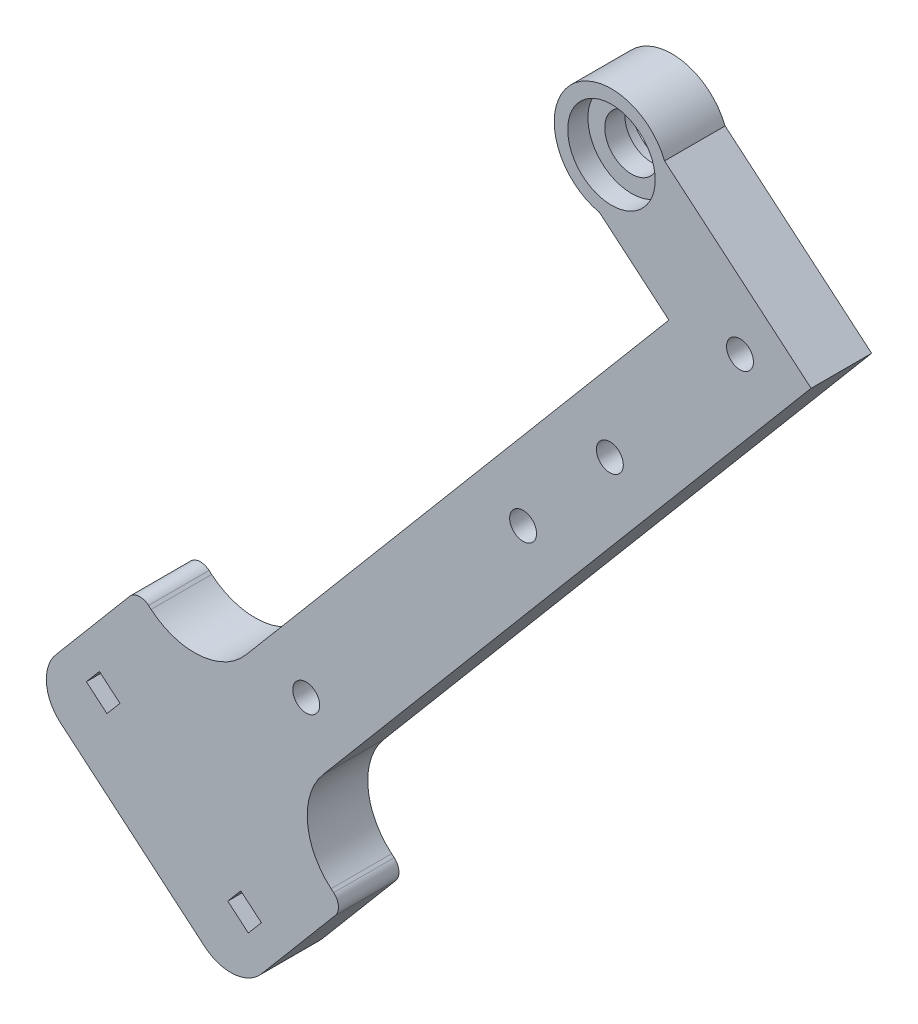
ISO-10303-21;
HEADER;
FILE_DESCRIPTION(('STEP AP214'),'2;1');
FILE_NAME('part.step','',(''),(''),'','','');
FILE_SCHEMA(('AUTOMOTIVE_DESIGN { 1 0 10303 214 1 1 1 1 }'));
ENDSEC;
DATA;
#1=APPLICATION_CONTEXT('core data for automotive mechanical design processes');
#2=APPLICATION_PROTOCOL_DEFINITION('international standard','automotive_design',2000,#1);
#3=PRODUCT_CONTEXT('',#1,'mechanical');
#4=PRODUCT('Part','Part','',(#3));
#5=PRODUCT_RELATED_PRODUCT_CATEGORY('part','',(#4));
#6=PRODUCT_DEFINITION_FORMATION('','',#4);
#7=PRODUCT_DEFINITION_CONTEXT('part definition',#1,'design');
#8=PRODUCT_DEFINITION('design','',#6,#7);
#9=PRODUCT_DEFINITION_SHAPE('','',#8);
#10=(LENGTH_UNIT() NAMED_UNIT(*) SI_UNIT(.MILLI.,.METRE.));
#11=(NAMED_UNIT(*) PLANE_ANGLE_UNIT() SI_UNIT($,.RADIAN.));
#12=(NAMED_UNIT(*) SI_UNIT($,.STERADIAN.) SOLID_ANGLE_UNIT());
#13=UNCERTAINTY_MEASURE_WITH_UNIT(LENGTH_MEASURE(1.E-05),#10,'distance_accuracy_value','');
#14=(GEOMETRIC_REPRESENTATION_CONTEXT(3) GLOBAL_UNCERTAINTY_ASSIGNED_CONTEXT((#13)) GLOBAL_UNIT_ASSIGNED_CONTEXT((#10,
#11,#12)) REPRESENTATION_CONTEXT('',''));
#15=CARTESIAN_POINT('',(0.,0.,0.));
#16=DIRECTION('',(0.,0.,1.));
#17=DIRECTION('',(1.,0.,0.));
#18=AXIS2_PLACEMENT_3D('',#15,#16,#17);
#19=CARTESIAN_POINT('',(-823.227608719742,-58.1969068134453,9.));
#20=DIRECTION('',(0.,0.,-1.));
#21=DIRECTION('',(-1.,0.,0.));
#22=AXIS2_PLACEMENT_3D('',#19,#20,#21);
#23=CYLINDRICAL_SURFACE('',#22,6.4999999999999);
#24=CARTESIAN_POINT('',(-823.227608719742,-58.1969068134453,0.));
#25=DIRECTION('',(0.,0.,1.));
#26=DIRECTION('',(1.,0.,0.));
#27=AXIS2_PLACEMENT_3D('',#24,#25,#26);
#28=CIRCLE('',#27,6.4999999999999);
#29=CARTESIAN_POINT('',(-816.727608719742,-58.1969068134453,0.));
#30=VERTEX_POINT('',#29);
#31=EDGE_CURVE('E307',#30,#30,#28,.T.);
#32=ORIENTED_EDGE('',*,*,#31,.F.);
#33=EDGE_LOOP('',(#32));
#34=FACE_BOUND('',#33,.T.);
#35=CARTESIAN_POINT('',(-823.227608719742,-58.1969068134453,3.));
#36=DIRECTION('',(0.,0.,1.));
#37=DIRECTION('',(1.,0.,0.));
#38=AXIS2_PLACEMENT_3D('',#35,#36,#37);
#39=CIRCLE('',#38,6.4999999999999);
#40=CARTESIAN_POINT('',(-816.727608719742,-58.1969068134453,3.));
#41=VERTEX_POINT('',#40);
#42=EDGE_CURVE('E523',#41,#41,#39,.T.);
#43=ORIENTED_EDGE('',*,*,#42,.T.);
#44=EDGE_LOOP('',(#43));
#45=FACE_BOUND('',#44,.T.);
#46=ADVANCED_FACE('F39',(#34,#45),#23,.F.);
#47=CARTESIAN_POINT('',(-421.116094761306,355.259526568365,9.));
#48=DIRECTION('',(0.76434263161328,-0.644810314354916,0.));
#49=DIRECTION('',(0.644810314354916,0.76434263161328,0.));
#50=AXIS2_PLACEMENT_3D('',#47,#48,#49);
#51=PLANE('',#50);
#52=DIRECTION('',(-0.644810314354916,-0.76434263161328,0.));
#53=VECTOR('',#52,1.);
#54=CARTESIAN_POINT('',(-421.116094761306,355.259526568365,0.));
#55=LINE('',#54,#53);
#56=CARTESIAN_POINT('',(-875.261177033281,-183.073126601523,0.));
#57=VERTEX_POINT('',#56);
#58=CARTESIAN_POINT('',(-877.195607976346,-185.366154496363,0.));
#59=VERTEX_POINT('',#58);
#60=EDGE_CURVE('E301',#57,#59,#55,.T.);
#61=ORIENTED_EDGE('',*,*,#60,.T.);
#62=DIRECTION('',(0.,0.,-1.));
#63=VECTOR('',#62,1.);
#64=CARTESIAN_POINT('',(-877.195607976346,-185.366154496363,9.));
#65=LINE('',#64,#63);
#66=CARTESIAN_POINT('',(-877.195607976346,-185.366154496363,9.));
#67=VERTEX_POINT('',#66);
#68=EDGE_CURVE('E48',#67,#59,#65,.T.);
#69=ORIENTED_EDGE('',*,*,#68,.F.);
#70=DIRECTION('',(-0.644810314354916,-0.76434263161328,0.));
#71=VECTOR('',#70,1.);
#72=CARTESIAN_POINT('',(-421.116094761306,355.259526568365,9.));
#73=LINE('',#72,#71);
#74=CARTESIAN_POINT('',(-875.261177033281,-183.073126601523,9.));
#75=VERTEX_POINT('',#74);
#76=EDGE_CURVE('E216',#75,#67,#73,.T.);
#77=ORIENTED_EDGE('',*,*,#76,.F.);
#78=DIRECTION('',(0.,0.,-1.));
#79=VECTOR('',#78,1.);
#80=CARTESIAN_POINT('',(-875.261177033281,-183.073126601523,9.));
#81=LINE('',#80,#79);
#82=EDGE_CURVE('E311',#75,#57,#81,.T.);
#83=ORIENTED_EDGE('',*,*,#82,.T.);
#84=EDGE_LOOP('',(#61,#69,#77,#83));
#85=FACE_BOUND('',#84,.T.);
#86=ADVANCED_FACE('F518',(#85),#51,.F.);
#87=CARTESIAN_POINT('',(-456.079513215022,-540.625681064728,9.));
#88=DIRECTION('',(-0.644810314354901,-0.764342631613293,0.));
#89=DIRECTION('',(0.764342631613293,-0.644810314354901,0.));
#90=AXIS2_PLACEMENT_3D('',#87,#88,#89);
#91=PLANE('',#90);
#92=DIRECTION('',(-0.764342631613293,0.644810314354901,0.));
#93=VECTOR('',#92,1.);
#94=CARTESIAN_POINT('',(-456.079513215022,-540.625681064728,0.));
#95=LINE('',#94,#93);
#96=CARTESIAN_POINT('',(-880.252978502799,-182.786913238943,0.));
#97=VERTEX_POINT('',#96);
#98=EDGE_CURVE('E223',#59,#97,#95,.T.);
#99=ORIENTED_EDGE('',*,*,#98,.T.);
#100=DIRECTION('',(0.,0.,-1.));
#101=VECTOR('',#100,1.);
#102=CARTESIAN_POINT('',(-880.252978502799,-182.786913238943,9.));
#103=LINE('',#102,#101);
#104=CARTESIAN_POINT('',(-880.252978502799,-182.786913238943,9.));
#105=VERTEX_POINT('',#104);
#106=EDGE_CURVE('E221',#105,#97,#103,.T.);
#107=ORIENTED_EDGE('',*,*,#106,.F.);
#108=DIRECTION('',(-0.764342631613293,0.644810314354901,0.));
#109=VECTOR('',#108,1.);
#110=CARTESIAN_POINT('',(-456.079513215022,-540.625681064728,9.));
#111=LINE('',#110,#109);
#112=EDGE_CURVE('E209',#67,#105,#111,.T.);
#113=ORIENTED_EDGE('',*,*,#112,.F.);
#114=ORIENTED_EDGE('',*,*,#68,.T.);
#115=EDGE_LOOP('',(#99,#107,#113,#114));
#116=FACE_BOUND('',#115,.T.);
#117=ADVANCED_FACE('F222',(#116),#91,.F.);
#118=CARTESIAN_POINT('',(-424.173465287799,357.838767825786,9.));
#119=DIRECTION('',(-0.764342631613309,0.644810314354882,0.));
#120=DIRECTION('',(-0.644810314354882,-0.764342631613309,0.));
#121=AXIS2_PLACEMENT_3D('',#118,#119,#120);
#122=PLANE('',#121);
#123=DIRECTION('',(0.644810314354882,0.764342631613309,0.));
#124=VECTOR('',#123,1.);
#125=CARTESIAN_POINT('',(-424.173465287799,357.838767825786,0.));
#126=LINE('',#125,#124);
#127=CARTESIAN_POINT('',(-878.318547559734,-180.493885344103,0.));
#128=VERTEX_POINT('',#127);
#129=EDGE_CURVE('E133',#97,#128,#126,.T.);
#130=ORIENTED_EDGE('',*,*,#129,.T.);
#131=DIRECTION('',(0.,0.,-1.));
#132=VECTOR('',#131,1.);
#133=CARTESIAN_POINT('',(-878.318547559734,-180.493885344103,9.));
#134=LINE('',#133,#132);
#135=CARTESIAN_POINT('',(-878.318547559734,-180.493885344103,9.));
#136=VERTEX_POINT('',#135);
#137=EDGE_CURVE('E224',#136,#128,#134,.T.);
#138=ORIENTED_EDGE('',*,*,#137,.F.);
#139=DIRECTION('',(0.644810314354882,0.764342631613309,0.));
#140=VECTOR('',#139,1.);
#141=CARTESIAN_POINT('',(-424.173465287799,357.838767825786,9.));
#142=LINE('',#141,#140);
#143=EDGE_CURVE('E214',#105,#136,#142,.T.);
#144=ORIENTED_EDGE('',*,*,#143,.F.);
#145=ORIENTED_EDGE('',*,*,#106,.T.);
#146=EDGE_LOOP('',(#130,#138,#144,#145));
#147=FACE_BOUND('',#146,.T.);
#148=ADVANCED_FACE('F226',(#147),#122,.F.);
#149=CARTESIAN_POINT('',(-442.135517130691,372.991810213125,9.));
#150=DIRECTION('',(0.764342631613295,-0.644810314354899,0.));
#151=DIRECTION('',(0.644810314354899,0.764342631613295,0.));
#152=AXIS2_PLACEMENT_3D('',#149,#150,#151);
#153=PLANE('',#152);
#154=DIRECTION('',(-0.644810314354899,-0.764342631613295,0.));
#155=VECTOR('',#154,1.);
#156=CARTESIAN_POINT('',(-442.135517130691,372.991810213125,0.));
#157=LINE('',#156,#155);
#158=CARTESIAN_POINT('',(-896.280599402647,-165.340842956764,0.));
#159=VERTEX_POINT('',#158);
#160=CARTESIAN_POINT('',(-898.215030345712,-167.633870851604,0.));
#161=VERTEX_POINT('',#160);
#162=EDGE_CURVE('E292',#159,#161,#157,.T.);
#163=ORIENTED_EDGE('',*,*,#162,.T.);
#164=DIRECTION('',(0.,0.,-1.));
#165=VECTOR('',#164,1.);
#166=CARTESIAN_POINT('',(-898.215030345712,-167.633870851604,9.));
#167=LINE('',#166,#165);
#168=CARTESIAN_POINT('',(-898.215030345712,-167.633870851604,9.));
#169=VERTEX_POINT('',#168);
#170=EDGE_CURVE('E313',#169,#161,#167,.T.);
#171=ORIENTED_EDGE('',*,*,#170,.F.);
#172=DIRECTION('',(-0.644810314354899,-0.764342631613295,0.));
#173=VECTOR('',#172,1.);
#174=CARTESIAN_POINT('',(-442.135517130691,372.991810213125,9.));
#175=LINE('',#174,#173);
#176=CARTESIAN_POINT('',(-896.280599402647,-165.340842956764,9.));
#177=VERTEX_POINT('',#176);
#178=EDGE_CURVE('E480',#177,#169,#175,.T.);
#179=ORIENTED_EDGE('',*,*,#178,.F.);
#180=DIRECTION('',(0.,0.,-1.));
#181=VECTOR('',#180,1.);
#182=CARTESIAN_POINT('',(-896.280599402647,-165.340842956764,9.));
#183=LINE('',#182,#181);
#184=EDGE_CURVE('E316',#177,#159,#183,.T.);
#185=ORIENTED_EDGE('',*,*,#184,.T.);
#186=EDGE_LOOP('',(#163,#171,#179,#185));
#187=FACE_BOUND('',#186,.T.);
#188=ADVANCED_FACE('F500',(#187),#153,.F.);
#189=CARTESIAN_POINT('',(-456.079513215044,-540.625681064728,9.));
#190=DIRECTION('',(-0.644810314354919,-0.764342631613278,0.));
#191=DIRECTION('',(0.764342631613278,-0.644810314354919,0.));
#192=AXIS2_PLACEMENT_3D('',#189,#190,#191);
#193=PLANE('',#192);
#194=DIRECTION('',(-0.764342631613278,0.644810314354919,0.));
#195=VECTOR('',#194,1.);
#196=CARTESIAN_POINT('',(-456.079513215044,-540.625681064728,0.));
#197=LINE('',#196,#195);
#198=CARTESIAN_POINT('',(-901.272400872164,-165.054629594184,0.));
#199=VERTEX_POINT('',#198);
#200=EDGE_CURVE('E295',#161,#199,#197,.T.);
#201=ORIENTED_EDGE('',*,*,#200,.T.);
#202=DIRECTION('',(0.,0.,-1.));
#203=VECTOR('',#202,1.);
#204=CARTESIAN_POINT('',(-901.272400872164,-165.054629594184,9.));
#205=LINE('',#204,#203);
#206=CARTESIAN_POINT('',(-901.272400872164,-165.054629594184,9.));
#207=VERTEX_POINT('',#206);
#208=EDGE_CURVE('E322',#207,#199,#205,.T.);
#209=ORIENTED_EDGE('',*,*,#208,.F.);
#210=DIRECTION('',(-0.764342631613278,0.644810314354919,0.));
#211=VECTOR('',#210,1.);
#212=CARTESIAN_POINT('',(-456.079513215044,-540.625681064728,9.));
#213=LINE('',#212,#211);
#214=EDGE_CURVE('E483',#169,#207,#213,.T.);
#215=ORIENTED_EDGE('',*,*,#214,.F.);
#216=ORIENTED_EDGE('',*,*,#170,.T.);
#217=EDGE_LOOP('',(#201,#209,#215,#216));
#218=FACE_BOUND('',#217,.T.);
#219=ADVANCED_FACE('F502',(#218),#193,.F.);
#220=CARTESIAN_POINT('',(-445.192887657148,375.571051470545,9.));
#221=DIRECTION('',(-0.764342631613297,0.644810314354895,0.));
#222=DIRECTION('',(-0.644810314354895,-0.764342631613298,0.));
#223=AXIS2_PLACEMENT_3D('',#220,#221,#222);
#224=PLANE('',#223);
#225=DIRECTION('',(0.644810314354895,0.764342631613297,0.));
#226=VECTOR('',#225,1.);
#227=CARTESIAN_POINT('',(-445.192887657148,375.571051470545,0.));
#228=LINE('',#227,#226);
#229=CARTESIAN_POINT('',(-899.3379699291,-162.761601699344,0.));
#230=VERTEX_POINT('',#229);
#231=EDGE_CURVE('E297',#199,#230,#228,.T.);
#232=ORIENTED_EDGE('',*,*,#231,.T.);
#233=DIRECTION('',(0.,0.,-1.));
#234=VECTOR('',#233,1.);
#235=CARTESIAN_POINT('',(-899.3379699291,-162.761601699344,9.));
#236=LINE('',#235,#234);
#237=CARTESIAN_POINT('',(-899.3379699291,-162.761601699344,9.));
#238=VERTEX_POINT('',#237);
#239=EDGE_CURVE('E319',#238,#230,#236,.T.);
#240=ORIENTED_EDGE('',*,*,#239,.F.);
#241=DIRECTION('',(0.644810314354895,0.764342631613297,0.));
#242=VECTOR('',#241,1.);
#243=CARTESIAN_POINT('',(-445.192887657148,375.571051470545,9.));
#244=LINE('',#243,#242);
#245=EDGE_CURVE('E485',#207,#238,#244,.T.);
#246=ORIENTED_EDGE('',*,*,#245,.F.);
#247=ORIENTED_EDGE('',*,*,#208,.T.);
#248=EDGE_LOOP('',(#232,#240,#246,#247));
#249=FACE_BOUND('',#248,.T.);
#250=ADVANCED_FACE('F506',(#249),#224,.F.);
#251=CARTESIAN_POINT('',(-879.822828210379,-185.766421709469,9.));
#252=DIRECTION('',(0.,0.,-1.));
#253=DIRECTION('',(-1.,0.,0.));
#254=AXIS2_PLACEMENT_3D('',#251,#252,#253);
#255=CYLINDRICAL_SURFACE('',#254,6.0000000000001);
#256=CARTESIAN_POINT('',(-879.822828210379,-185.766421709469,0.));
#257=DIRECTION('',(0.,0.,1.));
#258=DIRECTION('',(1.,0.,0.));
#259=AXIS2_PLACEMENT_3D('',#256,#257,#258);
#260=CIRCLE('',#259,6.0000000000001);
#261=CARTESIAN_POINT('',(-875.236772420699,-189.635283595598,0.));
#262=VERTEX_POINT('',#261);
#263=CARTESIAN_POINT('',(-883.691690096508,-190.352477499148,0.));
#264=VERTEX_POINT('',#263);
#265=EDGE_CURVE('E235',#262,#264,#260,.F.);
#266=ORIENTED_EDGE('',*,*,#265,.F.);
#267=DIRECTION('',(0.,0.,-1.));
#268=VECTOR('',#267,1.);
#269=CARTESIAN_POINT('',(-875.236772420699,-189.635283595598,9.));
#270=LINE('',#269,#268);
#271=CARTESIAN_POINT('',(-875.236772420699,-189.635283595598,9.));
#272=VERTEX_POINT('',#271);
#273=EDGE_CURVE('E147',#272,#262,#270,.T.);
#274=ORIENTED_EDGE('',*,*,#273,.F.);
#275=CARTESIAN_POINT('',(-879.822828210379,-185.766421709469,9.));
#276=DIRECTION('',(0.,0.,1.));
#277=DIRECTION('',(1.,0.,0.));
#278=AXIS2_PLACEMENT_3D('',#275,#276,#277);
#279=CIRCLE('',#278,6.0000000000001);
#280=CARTESIAN_POINT('',(-883.691690096508,-190.352477499148,9.));
#281=VERTEX_POINT('',#280);
#282=EDGE_CURVE('E310',#272,#281,#279,.F.);
#283=ORIENTED_EDGE('',*,*,#282,.T.);
#284=DIRECTION('',(0.,0.,-1.));
#285=VECTOR('',#284,1.);
#286=CARTESIAN_POINT('',(-883.691690096508,-190.352477499148,9.));
#287=LINE('',#286,#285);
#288=EDGE_CURVE('E234',#281,#264,#287,.T.);
#289=ORIENTED_EDGE('',*,*,#288,.T.);
#290=EDGE_LOOP('',(#266,#274,#283,#289));
#291=FACE_BOUND('',#290,.T.);
#292=ADVANCED_FACE('F41',(#291),#255,.T.);
#293=CARTESIAN_POINT('',(-417.867638576977,352.519082732357,9.));
#294=DIRECTION('',(-0.7643426316133,0.644810314354892,0.));
#295=DIRECTION('',(-0.644810314354892,-0.7643426316133,0.));
#296=AXIS2_PLACEMENT_3D('',#293,#294,#295);
#297=PLANE('',#296);
#298=DIRECTION('',(0.644810314354892,0.7643426316133,0.));
#299=VECTOR('',#298,1.);
#300=CARTESIAN_POINT('',(-417.867638576977,352.519082732357,0.));
#301=LINE('',#300,#299);
#302=CARTESIAN_POINT('',(-864.274997076665,-176.641458858172,0.));
#303=VERTEX_POINT('',#302);
#304=EDGE_CURVE('E238',#262,#303,#301,.T.);
#305=ORIENTED_EDGE('',*,*,#304,.T.);
#306=DIRECTION('',(0.,0.,-1.));
#307=VECTOR('',#306,1.);
#308=CARTESIAN_POINT('',(-864.274997076665,-176.641458858172,9.));
#309=LINE('',#308,#307);
#310=CARTESIAN_POINT('',(-864.274997076665,-176.641458858172,9.));
#311=VERTEX_POINT('',#310);
#312=EDGE_CURVE('E358',#311,#303,#309,.T.);
#313=ORIENTED_EDGE('',*,*,#312,.F.);
#314=DIRECTION('',(0.644810314354892,0.7643426316133,0.));
#315=VECTOR('',#314,1.);
#316=CARTESIAN_POINT('',(-417.867638576977,352.519082732357,9.));
#317=LINE('',#316,#315);
#318=EDGE_CURVE('E363',#272,#311,#317,.T.);
#319=ORIENTED_EDGE('',*,*,#318,.F.);
#320=ORIENTED_EDGE('',*,*,#273,.T.);
#321=EDGE_LOOP('',(#305,#313,#319,#320));
#322=FACE_BOUND('',#321,.T.);
#323=ADVANCED_FACE('F361',(#322),#297,.F.);
#324=CARTESIAN_POINT('',(-865.803682339892,-175.351838229462,9.));
#325=DIRECTION('',(0.,0.,-1.));
#326=DIRECTION('',(-1.,0.,0.));
#327=AXIS2_PLACEMENT_3D('',#324,#325,#326);
#328=CYLINDRICAL_SURFACE('',#327,2.00000000000018);
#329=CARTESIAN_POINT('',(-865.803682339892,-175.351838229462,0.));
#330=DIRECTION('',(0.,0.,1.));
#331=DIRECTION('',(1.,0.,0.));
#332=AXIS2_PLACEMENT_3D('',#329,#330,#331);
#333=CIRCLE('',#332,2.00000000000018);
#334=CARTESIAN_POINT('',(-864.514061711182,-173.823152966235,0.));
#335=VERTEX_POINT('',#334);
#336=EDGE_CURVE('E242',#335,#303,#333,.F.);
#337=ORIENTED_EDGE('',*,*,#336,.F.);
#338=DIRECTION('',(0.,0.,-1.));
#339=VECTOR('',#338,1.);
#340=CARTESIAN_POINT('',(-864.514061711182,-173.823152966235,9.));
#341=LINE('',#340,#339);
#342=CARTESIAN_POINT('',(-864.514061711182,-173.823152966235,9.));
#343=VERTEX_POINT('',#342);
#344=EDGE_CURVE('E356',#343,#335,#341,.T.);
#345=ORIENTED_EDGE('',*,*,#344,.F.);
#346=CARTESIAN_POINT('',(-865.803682339892,-175.351838229462,9.));
#347=DIRECTION('',(0.,0.,1.));
#348=DIRECTION('',(1.,0.,0.));
#349=AXIS2_PLACEMENT_3D('',#346,#347,#348);
#350=CIRCLE('',#349,2.00000000000018);
#351=EDGE_CURVE('E442',#343,#311,#350,.F.);
#352=ORIENTED_EDGE('',*,*,#351,.T.);
#353=ORIENTED_EDGE('',*,*,#312,.T.);
#354=EDGE_LOOP('',(#337,#345,#352,#353));
#355=FACE_BOUND('',#354,.T.);
#356=ADVANCED_FACE('F441',(#355),#328,.T.);
#357=CARTESIAN_POINT('',(-445.117737870732,-527.63185632731,9.));
#358=DIRECTION('',(-0.644810314354678,-0.764342631613481,0.));
#359=DIRECTION('',(0.764342631613481,-0.644810314354678,0.));
#360=AXIS2_PLACEMENT_3D('',#357,#358,#359);
#361=PLANE('',#360);
#362=DIRECTION('',(-0.764342631613481,0.644810314354678,0.));
#363=VECTOR('',#362,1.);
#364=CARTESIAN_POINT('',(-445.117737870732,-527.63185632731,0.));
#365=LINE('',#364,#363);
#366=CARTESIAN_POINT('',(-864.896233026989,-173.500747809058,0.));
#367=VERTEX_POINT('',#366);
#368=EDGE_CURVE('E245',#335,#367,#365,.T.);
#369=ORIENTED_EDGE('',*,*,#368,.T.);
#370=DIRECTION('',(0.,0.,-1.));
#371=VECTOR('',#370,1.);
#372=CARTESIAN_POINT('',(-864.896233026989,-173.500747809058,9.));
#373=LINE('',#372,#371);
#374=CARTESIAN_POINT('',(-864.896233026989,-173.500747809058,9.));
#375=VERTEX_POINT('',#374);
#376=EDGE_CURVE('E353',#375,#367,#373,.T.);
#377=ORIENTED_EDGE('',*,*,#376,.F.);
#378=DIRECTION('',(-0.764342631613481,0.644810314354678,0.));
#379=VECTOR('',#378,1.);
#380=CARTESIAN_POINT('',(-445.117737870732,-527.63185632731,9.));
#381=LINE('',#380,#379);
#382=EDGE_CURVE('E437',#343,#375,#381,.T.);
#383=ORIENTED_EDGE('',*,*,#382,.F.);
#384=ORIENTED_EDGE('',*,*,#344,.T.);
#385=EDGE_LOOP('',(#369,#377,#383,#384));
#386=FACE_BOUND('',#385,.T.);
#387=ADVANCED_FACE('F436',(#386),#361,.F.);
#388=CARTESIAN_POINT('',(-858.44812988344,-165.857321492925,9.));
#389=DIRECTION('',(0.,0.,-1.));
#390=DIRECTION('',(-1.,0.,0.));
#391=AXIS2_PLACEMENT_3D('',#388,#389,#390);
#392=CYLINDRICAL_SURFACE('',#391,9.99999999999989);
#393=CARTESIAN_POINT('',(-858.44812988344,-165.857321492925,0.));
#394=DIRECTION('',(0.,0.,1.));
#395=DIRECTION('',(1.,0.,0.));
#396=AXIS2_PLACEMENT_3D('',#393,#394,#395);
#397=CIRCLE('',#396,9.99999999999989);
#398=CARTESIAN_POINT('',(-866.091556199573,-159.409218349376,0.));
#399=VERTEX_POINT('',#398);
#400=EDGE_CURVE('E247',#367,#399,#397,.F.);
#401=ORIENTED_EDGE('',*,*,#400,.T.);
#402=DIRECTION('',(0.,0.,-1.));
#403=VECTOR('',#402,1.);
#404=CARTESIAN_POINT('',(-866.091556199573,-159.409218349376,9.));
#405=LINE('',#404,#403);
#406=CARTESIAN_POINT('',(-866.091556199573,-159.409218349376,9.));
#407=VERTEX_POINT('',#406);
#408=EDGE_CURVE('E350',#407,#399,#405,.T.);
#409=ORIENTED_EDGE('',*,*,#408,.F.);
#410=CARTESIAN_POINT('',(-858.44812988344,-165.857321492925,9.));
#411=DIRECTION('',(0.,0.,1.));
#412=DIRECTION('',(1.,0.,0.));
#413=AXIS2_PLACEMENT_3D('',#410,#411,#412);
#414=CIRCLE('',#413,9.99999999999989);
#415=EDGE_CURVE('E433',#375,#407,#414,.F.);
#416=ORIENTED_EDGE('',*,*,#415,.F.);
#417=ORIENTED_EDGE('',*,*,#376,.T.);
#418=EDGE_LOOP('',(#401,#409,#416,#417));
#419=FACE_BOUND('',#418,.T.);
#420=ADVANCED_FACE('F430',(#419),#392,.F.);
#421=CARTESIAN_POINT('',(-427.421921472166,360.579211661794,9.));
#422=DIRECTION('',(-0.764342631613317,0.644810314354872,0.));
#423=DIRECTION('',(-0.644810314354872,-0.764342631613317,0.));
#424=AXIS2_PLACEMENT_3D('',#421,#422,#423);
#425=PLANE('',#424);
#426=DIRECTION('',(0.644810314354872,0.764342631613317,0.));
#427=VECTOR('',#426,1.);
#428=CARTESIAN_POINT('',(-427.421921472166,360.579211661794,0.));
#429=LINE('',#428,#427);
#430=CARTESIAN_POINT('',(-793.550395834649,-73.4206722928768,0.));
#431=VERTEX_POINT('',#430);
#432=EDGE_CURVE('E249',#399,#431,#429,.T.);
#433=ORIENTED_EDGE('',*,*,#432,.T.);
#434=DIRECTION('',(0.,0.,-1.));
#435=VECTOR('',#434,1.);
#436=CARTESIAN_POINT('',(-793.550395834649,-73.4206722928768,9.));
#437=LINE('',#436,#435);
#438=CARTESIAN_POINT('',(-793.550395834649,-73.4206722928768,9.));
#439=VERTEX_POINT('',#438);
#440=EDGE_CURVE('E348',#439,#431,#437,.T.);
#441=ORIENTED_EDGE('',*,*,#440,.F.);
#442=DIRECTION('',(0.644810314354872,0.764342631613317,0.));
#443=VECTOR('',#442,1.);
#444=CARTESIAN_POINT('',(-427.421921472166,360.579211661794,9.));
#445=LINE('',#444,#443);
#446=EDGE_CURVE('E450',#407,#439,#445,.T.);
#447=ORIENTED_EDGE('',*,*,#446,.F.);
#448=ORIENTED_EDGE('',*,*,#408,.T.);
#449=EDGE_LOOP('',(#433,#441,#447,#448));
#450=FACE_BOUND('',#449,.T.);
#451=ADVANCED_FACE('F426',(#450),#425,.F.);
#452=CARTESIAN_POINT('',(-366.12847436249,-433.999883954671,9.));
#453=DIRECTION('',(0.644810314354878,0.764342631613312,0.));
#454=DIRECTION('',(-0.764342631613312,0.644810314354878,0.));
#455=AXIS2_PLACEMENT_3D('',#452,#453,#454);
#456=PLANE('',#455);
#457=DIRECTION('',(0.764342631613312,-0.644810314354878,0.));
#458=VECTOR('',#457,1.);
#459=CARTESIAN_POINT('',(-366.12847436249,-433.999883954671,0.));
#460=LINE('',#459,#458);
#461=CARTESIAN_POINT('',(-815.334160835627,-55.0435783337646,0.));
#462=VERTEX_POINT('',#461);
#463=EDGE_CURVE('E252',#462,#431,#460,.T.);
#464=ORIENTED_EDGE('',*,*,#463,.F.);
#465=DIRECTION('',(0.,0.,-1.));
#466=VECTOR('',#465,1.);
#467=CARTESIAN_POINT('',(-815.334160835627,-55.0435783337646,9.));
#468=LINE('',#467,#466);
#469=CARTESIAN_POINT('',(-815.334160835627,-55.0435783337646,9.));
#470=VERTEX_POINT('',#469);
#471=EDGE_CURVE('E346',#470,#462,#468,.T.);
#472=ORIENTED_EDGE('',*,*,#471,.F.);
#473=DIRECTION('',(0.764342631613312,-0.644810314354878,0.));
#474=VECTOR('',#473,1.);
#475=CARTESIAN_POINT('',(-366.12847436249,-433.999883954671,9.));
#476=LINE('',#475,#474);
#477=EDGE_CURVE('E423',#470,#439,#476,.T.);
#478=ORIENTED_EDGE('',*,*,#477,.T.);
#479=ORIENTED_EDGE('',*,*,#440,.T.);
#480=EDGE_LOOP('',(#464,#472,#478,#479));
#481=FACE_BOUND('',#480,.T.);
#482=ADVANCED_FACE('F418',(#481),#456,.T.);
#483=CARTESIAN_POINT('',(-823.227608719742,-58.1969068134453,9.));
#484=DIRECTION('',(0.,0.,-1.));
#485=DIRECTION('',(-1.,0.,0.));
#486=AXIS2_PLACEMENT_3D('',#483,#484,#485);
#487=CYLINDRICAL_SURFACE('',#486,8.4999999999999);
#488=CARTESIAN_POINT('',(-823.227608719742,-58.1969068134453,0.));
#489=DIRECTION('',(0.,0.,1.));
#490=DIRECTION('',(1.,0.,0.));
#491=AXIS2_PLACEMENT_3D('',#488,#489,#490);
#492=CIRCLE('',#491,8.4999999999999);
#493=CARTESIAN_POINT('',(-825.006315550952,-66.5087178079649,0.));
#494=VERTEX_POINT('',#493);
#495=EDGE_CURVE('E255',#462,#494,#492,.T.);
#496=ORIENTED_EDGE('',*,*,#495,.T.);
#497=DIRECTION('',(0.,0.,-1.));
#498=VECTOR('',#497,1.);
#499=CARTESIAN_POINT('',(-825.006315550952,-66.5087178079649,9.));
#500=LINE('',#499,#498);
#501=CARTESIAN_POINT('',(-825.006315550952,-66.5087178079649,9.));
#502=VERTEX_POINT('',#501);
#503=EDGE_CURVE('E343',#502,#494,#500,.T.);
#504=ORIENTED_EDGE('',*,*,#503,.F.);
#505=CARTESIAN_POINT('',(-823.227608719742,-58.1969068134453,9.));
#506=DIRECTION('',(0.,0.,1.));
#507=DIRECTION('',(1.,0.,0.));
#508=AXIS2_PLACEMENT_3D('',#505,#506,#507);
#509=CIRCLE('',#508,8.4999999999999);
#510=EDGE_CURVE('E453',#470,#502,#509,.T.);
#511=ORIENTED_EDGE('',*,*,#510,.F.);
#512=ORIENTED_EDGE('',*,*,#471,.T.);
#513=EDGE_LOOP('',(#496,#504,#511,#512));
#514=FACE_BOUND('',#513,.T.);
#515=ADVANCED_FACE('F601',(#514),#487,.T.);
#516=CARTESIAN_POINT('',(-375.800629077816,-445.465023428873,9.));
#517=DIRECTION('',(0.64481031435488,0.764342631613311,0.));
#518=DIRECTION('',(-0.764342631613311,0.64481031435488,0.));
#519=AXIS2_PLACEMENT_3D('',#516,#517,#518);
#520=PLANE('',#519);
#521=DIRECTION('',(0.764342631613311,-0.64481031435488,0.));
#522=VECTOR('',#521,1.);
#523=CARTESIAN_POINT('',(-375.800629077816,-445.465023428873,0.));
#524=LINE('',#523,#522);
#525=CARTESIAN_POINT('',(-814.687690024172,-75.2136570517568,0.));
#526=VERTEX_POINT('',#525);
#527=EDGE_CURVE('E257',#494,#526,#524,.T.);
#528=ORIENTED_EDGE('',*,*,#527,.T.);
#529=DIRECTION('',(0.,0.,-1.));
#530=VECTOR('',#529,1.);
#531=CARTESIAN_POINT('',(-814.687690024172,-75.2136570517568,9.));
#532=LINE('',#531,#530);
#533=CARTESIAN_POINT('',(-814.687690024172,-75.2136570517568,9.));
#534=VERTEX_POINT('',#533);
#535=EDGE_CURVE('E341',#534,#526,#532,.T.);
#536=ORIENTED_EDGE('',*,*,#535,.F.);
#537=DIRECTION('',(0.764342631613311,-0.64481031435488,0.));
#538=VECTOR('',#537,1.);
#539=CARTESIAN_POINT('',(-375.800629077816,-445.465023428873,9.));
#540=LINE('',#539,#538);
#541=EDGE_CURVE('E455',#502,#534,#540,.T.);
#542=ORIENTED_EDGE('',*,*,#541,.F.);
#543=ORIENTED_EDGE('',*,*,#503,.T.);
#544=EDGE_LOOP('',(#528,#536,#542,#543));
#545=FACE_BOUND('',#544,.T.);
#546=ADVANCED_FACE('F411',(#545),#520,.F.);
#547=CARTESIAN_POINT('',(-438.887060946344,370.251366377117,9.));
#548=DIRECTION('',(-0.764342631613301,0.644810314354891,0.));
#549=DIRECTION('',(-0.644810314354891,-0.764342631613301,0.));
#550=AXIS2_PLACEMENT_3D('',#547,#548,#549);
#551=PLANE('',#550);
#552=DIRECTION('',(0.644810314354891,0.764342631613301,0.));
#553=VECTOR('',#552,1.);
#554=CARTESIAN_POINT('',(-438.887060946344,370.251366377117,0.));
#555=LINE('',#554,#553);
#556=CARTESIAN_POINT('',(-877.556695673772,-149.737063634052,0.));
#557=VERTEX_POINT('',#556);
#558=EDGE_CURVE('E260',#557,#526,#555,.T.);
#559=ORIENTED_EDGE('',*,*,#558,.F.);
#560=DIRECTION('',(0.,0.,-1.));
#561=VECTOR('',#560,1.);
#562=CARTESIAN_POINT('',(-877.556695673772,-149.737063634052,9.));
#563=LINE('',#562,#561);
#564=CARTESIAN_POINT('',(-877.556695673772,-149.737063634052,9.));
#565=VERTEX_POINT('',#564);
#566=EDGE_CURVE('E339',#565,#557,#563,.T.);
#567=ORIENTED_EDGE('',*,*,#566,.F.);
#568=DIRECTION('',(0.644810314354891,0.764342631613301,0.));
#569=VECTOR('',#568,1.);
#570=CARTESIAN_POINT('',(-438.887060946344,370.251366377117,9.));
#571=LINE('',#570,#569);
#572=EDGE_CURVE('E408',#565,#534,#571,.T.);
#573=ORIENTED_EDGE('',*,*,#572,.T.);
#574=ORIENTED_EDGE('',*,*,#535,.T.);
#575=EDGE_LOOP('',(#559,#567,#573,#574));
#576=FACE_BOUND('',#575,.T.);
#577=ADVANCED_FACE('F403',(#576),#551,.T.);
#578=CARTESIAN_POINT('',(-885.200121989906,-143.288960490504,9.));
#579=DIRECTION('',(0.,0.,-1.));
#580=DIRECTION('',(-1.,0.,0.));
#581=AXIS2_PLACEMENT_3D('',#578,#579,#580);
#582=CYLINDRICAL_SURFACE('',#581,9.99999999999991);
#583=CARTESIAN_POINT('',(-885.200121989906,-143.288960490504,0.));
#584=DIRECTION('',(0.,0.,1.));
#585=DIRECTION('',(1.,0.,0.));
#586=AXIS2_PLACEMENT_3D('',#583,#584,#585);
#587=CIRCLE('',#586,9.99999999999991);
#588=CARTESIAN_POINT('',(-891.648225133455,-150.932386806637,0.));
#589=VERTEX_POINT('',#588);
#590=EDGE_CURVE('E263',#557,#589,#587,.F.);
#591=ORIENTED_EDGE('',*,*,#590,.T.);
#592=DIRECTION('',(0.,0.,-1.));
#593=VECTOR('',#592,1.);
#594=CARTESIAN_POINT('',(-891.648225133455,-150.932386806637,9.));
#595=LINE('',#594,#593);
#596=CARTESIAN_POINT('',(-891.648225133455,-150.932386806637,9.));
#597=VERTEX_POINT('',#596);
#598=EDGE_CURVE('E336',#597,#589,#595,.T.);
#599=ORIENTED_EDGE('',*,*,#598,.F.);
#600=CARTESIAN_POINT('',(-885.200121989906,-143.288960490504,9.));
#601=DIRECTION('',(0.,0.,1.));
#602=DIRECTION('',(1.,0.,0.));
#603=AXIS2_PLACEMENT_3D('',#600,#601,#602);
#604=CIRCLE('',#603,9.99999999999991);
#605=EDGE_CURVE('E458',#565,#597,#604,.F.);
#606=ORIENTED_EDGE('',*,*,#605,.F.);
#607=ORIENTED_EDGE('',*,*,#566,.T.);
#608=EDGE_LOOP('',(#591,#599,#606,#607));
#609=FACE_BOUND('',#608,.T.);
#610=ADVANCED_FACE('F594',(#609),#582,.F.);
#611=CARTESIAN_POINT('',(-445.117737871253,-527.631856327303,9.));
#612=DIRECTION('',(-0.644810314355124,-0.764342631613105,0.));
#613=DIRECTION('',(0.764342631613105,-0.644810314355124,0.));
#614=AXIS2_PLACEMENT_3D('',#611,#612,#613);
#615=PLANE('',#614);
#616=DIRECTION('',(-0.764342631613105,0.644810314355124,0.));
#617=VECTOR('',#616,1.);
#618=CARTESIAN_POINT('',(-445.117737871253,-527.631856327303,0.));
#619=LINE('',#618,#617);
#620=CARTESIAN_POINT('',(-892.030396449261,-150.609981649459,0.));
#621=VERTEX_POINT('',#620);
#622=EDGE_CURVE('E265',#589,#621,#619,.T.);
#623=ORIENTED_EDGE('',*,*,#622,.T.);
#624=DIRECTION('',(0.,0.,-1.));
#625=VECTOR('',#624,1.);
#626=CARTESIAN_POINT('',(-892.030396449261,-150.609981649459,9.));
#627=LINE('',#626,#625);
#628=CARTESIAN_POINT('',(-892.030396449261,-150.609981649459,9.));
#629=VERTEX_POINT('',#628);
#630=EDGE_CURVE('E334',#629,#621,#627,.T.);
#631=ORIENTED_EDGE('',*,*,#630,.F.);
#632=DIRECTION('',(-0.764342631613105,0.644810314355124,0.));
#633=VECTOR('',#632,1.);
#634=CARTESIAN_POINT('',(-445.117737871253,-527.631856327303,9.));
#635=LINE('',#634,#633);
#636=EDGE_CURVE('E460',#597,#629,#635,.T.);
#637=ORIENTED_EDGE('',*,*,#636,.F.);
#638=ORIENTED_EDGE('',*,*,#598,.T.);
#639=EDGE_LOOP('',(#623,#631,#637,#638));
#640=FACE_BOUND('',#639,.T.);
#641=ADVANCED_FACE('F396',(#640),#615,.F.);
#642=CARTESIAN_POINT('',(-893.320017077971,-152.138666912686,9.));
#643=DIRECTION('',(0.,0.,-1.));
#644=DIRECTION('',(-1.,0.,0.));
#645=AXIS2_PLACEMENT_3D('',#642,#643,#644);
#646=CYLINDRICAL_SURFACE('',#645,1.99999999999995);
#647=CARTESIAN_POINT('',(-893.320017077971,-152.138666912686,0.));
#648=DIRECTION('',(0.,0.,1.));
#649=DIRECTION('',(1.,0.,0.));
#650=AXIS2_PLACEMENT_3D('',#647,#648,#649);
#651=CIRCLE('',#650,1.99999999999995);
#652=CARTESIAN_POINT('',(-894.848702341198,-150.849046283976,0.));
#653=VERTEX_POINT('',#652);
#654=EDGE_CURVE('E268',#653,#621,#651,.F.);
#655=ORIENTED_EDGE('',*,*,#654,.F.);
#656=DIRECTION('',(0.,0.,-1.));
#657=VECTOR('',#656,1.);
#658=CARTESIAN_POINT('',(-894.848702341198,-150.849046283976,9.));
#659=LINE('',#658,#657);
#660=CARTESIAN_POINT('',(-894.848702341198,-150.849046283976,9.));
#661=VERTEX_POINT('',#660);
#662=EDGE_CURVE('E332',#661,#653,#659,.T.);
#663=ORIENTED_EDGE('',*,*,#662,.F.);
#664=CARTESIAN_POINT('',(-893.320017077971,-152.138666912686,9.));
#665=DIRECTION('',(0.,0.,1.));
#666=DIRECTION('',(1.,0.,0.));
#667=AXIS2_PLACEMENT_3D('',#664,#665,#666);
#668=CIRCLE('',#667,1.99999999999995);
#669=EDGE_CURVE('E393',#661,#629,#668,.F.);
#670=ORIENTED_EDGE('',*,*,#669,.T.);
#671=ORIENTED_EDGE('',*,*,#630,.T.);
#672=EDGE_LOOP('',(#655,#663,#670,#671));
#673=FACE_BOUND('',#672,.T.);
#674=ADVANCED_FACE('F389',(#673),#646,.T.);
#675=CARTESIAN_POINT('',(-448.441343841504,378.311495306553,9.));
#676=DIRECTION('',(0.764342631613297,-0.644810314354896,0.));
#677=DIRECTION('',(0.644810314354896,0.764342631613297,0.));
#678=AXIS2_PLACEMENT_3D('',#675,#676,#677);
#679=PLANE('',#678);
#680=DIRECTION('',(-0.644810314354896,-0.764342631613297,0.));
#681=VECTOR('',#680,1.);
#682=CARTESIAN_POINT('',(-448.441343841504,378.311495306553,0.));
#683=LINE('',#682,#681);
#684=CARTESIAN_POINT('',(-905.810477685231,-163.842871021402,0.));
#685=VERTEX_POINT('',#684);
#686=EDGE_CURVE('E271',#653,#685,#683,.T.);
#687=ORIENTED_EDGE('',*,*,#686,.T.);
#688=DIRECTION('',(0.,0.,-1.));
#689=VECTOR('',#688,1.);
#690=CARTESIAN_POINT('',(-905.810477685231,-163.842871021402,9.));
#691=LINE('',#690,#689);
#692=CARTESIAN_POINT('',(-905.810477685231,-163.842871021402,9.));
#693=VERTEX_POINT('',#692);
#694=EDGE_CURVE('E330',#693,#685,#691,.T.);
#695=ORIENTED_EDGE('',*,*,#694,.F.);
#696=DIRECTION('',(-0.644810314354896,-0.764342631613297,0.));
#697=VECTOR('',#696,1.);
#698=CARTESIAN_POINT('',(-448.441343841504,378.311495306553,9.));
#699=LINE('',#698,#697);
#700=EDGE_CURVE('E463',#661,#693,#699,.T.);
#701=ORIENTED_EDGE('',*,*,#700,.F.);
#702=ORIENTED_EDGE('',*,*,#662,.T.);
#703=EDGE_LOOP('',(#687,#695,#701,#702));
#704=FACE_BOUND('',#703,.T.);
#705=ADVANCED_FACE('F385',(#704),#679,.F.);
#706=CARTESIAN_POINT('',(-901.224421895551,-167.711732907532,9.));
#707=DIRECTION('',(0.,0.,-1.));
#708=DIRECTION('',(-1.,0.,0.));
#709=AXIS2_PLACEMENT_3D('',#706,#707,#708);
#710=CYLINDRICAL_SURFACE('',#709,5.99999999999996);
#711=CARTESIAN_POINT('',(-901.224421895551,-167.711732907532,0.));
#712=DIRECTION('',(0.,0.,1.));
#713=DIRECTION('',(1.,0.,0.));
#714=AXIS2_PLACEMENT_3D('',#711,#712,#713);
#715=CIRCLE('',#714,5.99999999999996);
#716=CARTESIAN_POINT('',(-905.09328378168,-172.297788697212,0.));
#717=VERTEX_POINT('',#716);
#718=EDGE_CURVE('E274',#717,#685,#715,.F.);
#719=ORIENTED_EDGE('',*,*,#718,.F.);
#720=DIRECTION('',(0.,0.,-1.));
#721=VECTOR('',#720,1.);
#722=CARTESIAN_POINT('',(-905.09328378168,-172.297788697212,9.));
#723=LINE('',#722,#721);
#724=CARTESIAN_POINT('',(-905.09328378168,-172.297788697212,9.));
#725=VERTEX_POINT('',#724);
#726=EDGE_CURVE('E328',#725,#717,#723,.T.);
#727=ORIENTED_EDGE('',*,*,#726,.F.);
#728=CARTESIAN_POINT('',(-901.224421895551,-167.711732907532,9.));
#729=DIRECTION('',(0.,0.,1.));
#730=DIRECTION('',(1.,0.,0.));
#731=AXIS2_PLACEMENT_3D('',#728,#729,#730);
#732=CIRCLE('',#731,5.99999999999996);
#733=EDGE_CURVE('E382',#725,#693,#732,.F.);
#734=ORIENTED_EDGE('',*,*,#733,.T.);
#735=ORIENTED_EDGE('',*,*,#694,.T.);
#736=EDGE_LOOP('',(#719,#727,#734,#735));
#737=FACE_BOUND('',#736,.T.);
#738=ADVANCED_FACE('F378',(#737),#710,.T.);
#739=CARTESIAN_POINT('',(-454.145082271916,-538.33265316989,9.));
#740=DIRECTION('',(0.644810314354865,0.764342631613323,0.));
#741=DIRECTION('',(-0.764342631613323,0.644810314354865,0.));
#742=AXIS2_PLACEMENT_3D('',#739,#740,#741);
#743=PLANE('',#742);
#744=DIRECTION('',(0.764342631613323,-0.644810314354865,0.));
#745=VECTOR('',#744,1.);
#746=CARTESIAN_POINT('',(-454.145082271916,-538.33265316989,0.));
#747=LINE('',#746,#745);
#748=EDGE_CURVE('E139',#128,#57,#747,.T.);
#749=ORIENTED_EDGE('',*,*,#748,.T.);
#750=ORIENTED_EDGE('',*,*,#82,.F.);
#751=DIRECTION('',(0.764342631613323,-0.644810314354865,0.));
#752=VECTOR('',#751,1.);
#753=CARTESIAN_POINT('',(-454.145082271916,-538.33265316989,9.));
#754=LINE('',#753,#752);
#755=EDGE_CURVE('E56',#136,#75,#754,.T.);
#756=ORIENTED_EDGE('',*,*,#755,.F.);
#757=ORIENTED_EDGE('',*,*,#137,.T.);
#758=EDGE_LOOP('',(#749,#750,#756,#757));
#759=FACE_BOUND('',#758,.T.);
#760=ADVANCED_FACE('F550',(#759),#743,.F.);
#761=CARTESIAN_POINT('',(-454.145082271944,-538.332653169889,9.));
#762=DIRECTION('',(0.644810314354889,0.764342631613303,0.));
#763=DIRECTION('',(-0.764342631613303,0.644810314354889,0.));
#764=AXIS2_PLACEMENT_3D('',#761,#762,#763);
#765=PLANE('',#764);
#766=DIRECTION('',(0.764342631613303,-0.644810314354889,0.));
#767=VECTOR('',#766,1.);
#768=CARTESIAN_POINT('',(-454.145082271944,-538.332653169889,0.));
#769=LINE('',#768,#767);
#770=EDGE_CURVE('E299',#230,#159,#769,.T.);
#771=ORIENTED_EDGE('',*,*,#770,.T.);
#772=ORIENTED_EDGE('',*,*,#184,.F.);
#773=DIRECTION('',(0.764342631613303,-0.644810314354889,0.));
#774=VECTOR('',#773,1.);
#775=CARTESIAN_POINT('',(-454.145082271944,-538.332653169889,9.));
#776=LINE('',#775,#774);
#777=EDGE_CURVE('E487',#238,#177,#776,.T.);
#778=ORIENTED_EDGE('',*,*,#777,.F.);
#779=ORIENTED_EDGE('',*,*,#239,.T.);
#780=EDGE_LOOP('',(#771,#772,#778,#779));
#781=FACE_BOUND('',#780,.T.);
#782=ADVANCED_FACE('F496',(#781),#765,.F.);
#783=CARTESIAN_POINT('',(-804.11904292941,-74.3171646723175,9.));
#784=DIRECTION('',(0.,0.,-1.));
#785=DIRECTION('',(-1.,0.,0.));
#786=AXIS2_PLACEMENT_3D('',#783,#784,#785);
#787=CYLINDRICAL_SURFACE('',#786,2.);
#788=CARTESIAN_POINT('',(-804.11904292941,-74.3171646723175,9.));
#789=DIRECTION('',(0.,0.,1.));
#790=DIRECTION('',(1.,0.,0.));
#791=AXIS2_PLACEMENT_3D('',#788,#789,#790);
#792=CIRCLE('',#791,2.);
#793=CARTESIAN_POINT('',(-802.11904292941,-74.3171646723175,9.));
#794=VERTEX_POINT('',#793);
#795=EDGE_CURVE('E477',#794,#794,#792,.T.);
#796=ORIENTED_EDGE('',*,*,#795,.T.);
#797=EDGE_LOOP('',(#796));
#798=FACE_BOUND('',#797,.T.);
#799=CARTESIAN_POINT('',(-804.11904292941,-74.3171646723175,0.));
#800=DIRECTION('',(0.,0.,1.));
#801=DIRECTION('',(1.,0.,0.));
#802=AXIS2_PLACEMENT_3D('',#799,#800,#801);
#803=CIRCLE('',#802,2.);
#804=CARTESIAN_POINT('',(-802.11904292941,-74.3171646723175,0.));
#805=VERTEX_POINT('',#804);
#806=EDGE_CURVE('E289',#805,#805,#803,.T.);
#807=ORIENTED_EDGE('',*,*,#806,.F.);
#808=EDGE_LOOP('',(#807));
#809=FACE_BOUND('',#808,.T.);
#810=ADVANCED_FACE('F562',(#798,#809),#787,.F.);
#811=CARTESIAN_POINT('',(-868.600074364899,-150.751427833648,9.));
#812=DIRECTION('',(0.,0.,-1.));
#813=DIRECTION('',(-1.,0.,0.));
#814=AXIS2_PLACEMENT_3D('',#811,#812,#813);
#815=CYLINDRICAL_SURFACE('',#814,2.);
#816=CARTESIAN_POINT('',(-868.600074364899,-150.751427833648,9.));
#817=DIRECTION('',(0.,0.,1.));
#818=DIRECTION('',(1.,0.,0.));
#819=AXIS2_PLACEMENT_3D('',#816,#817,#818);
#820=CIRCLE('',#819,2.);
#821=CARTESIAN_POINT('',(-866.600074364899,-150.751427833648,9.));
#822=VERTEX_POINT('',#821);
#823=EDGE_CURVE('E474',#822,#822,#820,.T.);
#824=ORIENTED_EDGE('',*,*,#823,.T.);
#825=EDGE_LOOP('',(#824));
#826=FACE_BOUND('',#825,.T.);
#827=CARTESIAN_POINT('',(-868.600074364899,-150.751427833648,0.));
#828=DIRECTION('',(0.,0.,1.));
#829=DIRECTION('',(1.,0.,0.));
#830=AXIS2_PLACEMENT_3D('',#827,#828,#829);
#831=CIRCLE('',#830,2.);
#832=CARTESIAN_POINT('',(-866.600074364899,-150.751427833648,0.));
#833=VERTEX_POINT('',#832);
#834=EDGE_CURVE('E286',#833,#833,#831,.T.);
#835=ORIENTED_EDGE('',*,*,#834,.F.);
#836=EDGE_LOOP('',(#835));
#837=FACE_BOUND('',#836,.T.);
#838=ADVANCED_FACE('F571',(#826,#837),#815,.F.);
#839=CARTESIAN_POINT('',(-836.359558647154,-112.534296252983,9.));
#840=DIRECTION('',(0.,0.,-1.));
#841=DIRECTION('',(-1.,0.,0.));
#842=AXIS2_PLACEMENT_3D('',#839,#840,#841);
#843=CYLINDRICAL_SURFACE('',#842,1.99999999999993);
#844=CARTESIAN_POINT('',(-836.359558647154,-112.534296252983,9.));
#845=DIRECTION('',(0.,0.,1.));
#846=DIRECTION('',(1.,0.,0.));
#847=AXIS2_PLACEMENT_3D('',#844,#845,#846);
#848=CIRCLE('',#847,1.99999999999993);
#849=CARTESIAN_POINT('',(-834.359558647154,-112.534296252983,9.));
#850=VERTEX_POINT('',#849);
#851=EDGE_CURVE('E471',#850,#850,#848,.T.);
#852=ORIENTED_EDGE('',*,*,#851,.T.);
#853=EDGE_LOOP('',(#852));
#854=FACE_BOUND('',#853,.T.);
#855=CARTESIAN_POINT('',(-836.359558647154,-112.534296252983,0.));
#856=DIRECTION('',(0.,0.,1.));
#857=DIRECTION('',(1.,0.,0.));
#858=AXIS2_PLACEMENT_3D('',#855,#856,#857);
#859=CIRCLE('',#858,1.99999999999993);
#860=CARTESIAN_POINT('',(-834.359558647154,-112.534296252983,0.));
#861=VERTEX_POINT('',#860);
#862=EDGE_CURVE('E283',#861,#861,#859,.T.);
#863=ORIENTED_EDGE('',*,*,#862,.F.);
#864=EDGE_LOOP('',(#863));
#865=FACE_BOUND('',#864,.T.);
#866=ADVANCED_FACE('F575',(#854,#865),#843,.F.);
#867=CARTESIAN_POINT('',(-823.463352360056,-97.2474436207166,9.));
#868=DIRECTION('',(0.,0.,-1.));
#869=DIRECTION('',(-1.,0.,0.));
#870=AXIS2_PLACEMENT_3D('',#867,#868,#869);
#871=CYLINDRICAL_SURFACE('',#870,2.00000000000012);
#872=CARTESIAN_POINT('',(-823.463352360056,-97.2474436207166,9.));
#873=DIRECTION('',(0.,0.,1.));
#874=DIRECTION('',(1.,0.,0.));
#875=AXIS2_PLACEMENT_3D('',#872,#873,#874);
#876=CIRCLE('',#875,2.00000000000012);
#877=CARTESIAN_POINT('',(-821.463352360056,-97.2474436207166,9.));
#878=VERTEX_POINT('',#877);
#879=EDGE_CURVE('E468',#878,#878,#876,.T.);
#880=ORIENTED_EDGE('',*,*,#879,.T.);
#881=EDGE_LOOP('',(#880));
#882=FACE_BOUND('',#881,.T.);
#883=CARTESIAN_POINT('',(-823.463352360056,-97.2474436207166,0.));
#884=DIRECTION('',(0.,0.,1.));
#885=DIRECTION('',(1.,0.,0.));
#886=AXIS2_PLACEMENT_3D('',#883,#884,#885);
#887=CIRCLE('',#886,2.00000000000012);
#888=CARTESIAN_POINT('',(-821.463352360056,-97.2474436207166,0.));
#889=VERTEX_POINT('',#888);
#890=EDGE_CURVE('E280',#889,#889,#887,.T.);
#891=ORIENTED_EDGE('',*,*,#890,.F.);
#892=EDGE_LOOP('',(#891));
#893=FACE_BOUND('',#892,.T.);
#894=ADVANCED_FACE('F579',(#882,#893),#871,.F.);
#895=CARTESIAN_POINT('',(-461.237995729848,-546.740422117635,9.));
#896=DIRECTION('',(0.644810314354889,0.764342631613303,0.));
#897=DIRECTION('',(-0.764342631613303,0.644810314354889,0.));
#898=AXIS2_PLACEMENT_3D('',#895,#896,#897);
#899=PLANE('',#898);
#900=DIRECTION('',(0.764342631613303,-0.644810314354889,0.));
#901=VECTOR('',#900,1.);
#902=CARTESIAN_POINT('',(-461.237995729848,-546.740422117635,0.));
#903=LINE('',#902,#901);
#904=EDGE_CURVE('E277',#717,#264,#903,.T.);
#905=ORIENTED_EDGE('',*,*,#904,.T.);
#906=ORIENTED_EDGE('',*,*,#288,.F.);
#907=DIRECTION('',(0.764342631613303,-0.644810314354889,0.));
#908=VECTOR('',#907,1.);
#909=CARTESIAN_POINT('',(-461.237995729848,-546.740422117635,9.));
#910=LINE('',#909,#908);
#911=EDGE_CURVE('E466',#725,#281,#910,.T.);
#912=ORIENTED_EDGE('',*,*,#911,.F.);
#913=ORIENTED_EDGE('',*,*,#726,.T.);
#914=EDGE_LOOP('',(#905,#906,#912,#913));
#915=FACE_BOUND('',#914,.T.);
#916=ADVANCED_FACE('F374',(#915),#899,.F.);
#917=CARTESIAN_POINT('',(-823.227608719742,-58.1969068134453,6.));
#918=DIRECTION('',(0.,0.,1.));
#919=DIRECTION('',(1.,0.,0.));
#920=AXIS2_PLACEMENT_3D('',#917,#918,#919);
#921=CIRCLE('',#920,6.4999999999999);
#922=CARTESIAN_POINT('',(-816.727608719742,-58.1969068134453,6.));
#923=VERTEX_POINT('',#922);
#924=EDGE_CURVE('E11',#923,#923,#921,.T.);
#925=ORIENTED_EDGE('',*,*,#924,.F.);
#926=EDGE_LOOP('',(#925));
#927=FACE_BOUND('',#926,.T.);
#928=CARTESIAN_POINT('',(-823.227608719742,-58.1969068134453,9.));
#929=DIRECTION('',(0.,0.,1.));
#930=DIRECTION('',(1.,0.,0.));
#931=AXIS2_PLACEMENT_3D('',#928,#929,#930);
#932=CIRCLE('',#931,6.4999999999999);
#933=CARTESIAN_POINT('',(-816.727608719742,-58.1969068134453,9.));
#934=VERTEX_POINT('',#933);
#935=EDGE_CURVE('E228',#934,#934,#932,.T.);
#936=ORIENTED_EDGE('',*,*,#935,.T.);
#937=EDGE_LOOP('',(#936));
#938=FACE_BOUND('',#937,.T.);
#939=ADVANCED_FACE('F520',(#927,#938),#23,.F.);
#940=CARTESIAN_POINT('',(0.,0.,9.));
#941=DIRECTION('',(0.,0.,1.));
#942=DIRECTION('',(1.,0.,0.));
#943=AXIS2_PLACEMENT_3D('',#940,#941,#942);
#944=PLANE('',#943);
#945=ORIENTED_EDGE('',*,*,#282,.F.);
#946=ORIENTED_EDGE('',*,*,#318,.T.);
#947=ORIENTED_EDGE('',*,*,#351,.F.);
#948=ORIENTED_EDGE('',*,*,#382,.T.);
#949=ORIENTED_EDGE('',*,*,#415,.T.);
#950=ORIENTED_EDGE('',*,*,#446,.T.);
#951=ORIENTED_EDGE('',*,*,#477,.F.);
#952=ORIENTED_EDGE('',*,*,#510,.T.);
#953=ORIENTED_EDGE('',*,*,#541,.T.);
#954=ORIENTED_EDGE('',*,*,#572,.F.);
#955=ORIENTED_EDGE('',*,*,#605,.T.);
#956=ORIENTED_EDGE('',*,*,#636,.T.);
#957=ORIENTED_EDGE('',*,*,#669,.F.);
#958=ORIENTED_EDGE('',*,*,#700,.T.);
#959=ORIENTED_EDGE('',*,*,#733,.F.);
#960=ORIENTED_EDGE('',*,*,#911,.T.);
#961=EDGE_LOOP('',(#945,#946,#947,#948,#949,#950,#951,#952,#953,#954,#955,#956,#957,#958,#959,#960));
#962=FACE_BOUND('',#961,.T.);
#963=ORIENTED_EDGE('',*,*,#879,.F.);
#964=EDGE_LOOP('',(#963));
#965=FACE_BOUND('',#964,.T.);
#966=ORIENTED_EDGE('',*,*,#851,.F.);
#967=EDGE_LOOP('',(#966));
#968=FACE_BOUND('',#967,.T.);
#969=ORIENTED_EDGE('',*,*,#823,.F.);
#970=EDGE_LOOP('',(#969));
#971=FACE_BOUND('',#970,.T.);
#972=ORIENTED_EDGE('',*,*,#795,.F.);
#973=EDGE_LOOP('',(#972));
#974=FACE_BOUND('',#973,.T.);
#975=ORIENTED_EDGE('',*,*,#178,.T.);
#976=ORIENTED_EDGE('',*,*,#214,.T.);
#977=ORIENTED_EDGE('',*,*,#245,.T.);
#978=ORIENTED_EDGE('',*,*,#777,.T.);
#979=EDGE_LOOP('',(#975,#976,#977,#978));
#980=FACE_BOUND('',#979,.T.);
#981=ORIENTED_EDGE('',*,*,#76,.T.);
#982=ORIENTED_EDGE('',*,*,#112,.T.);
#983=ORIENTED_EDGE('',*,*,#143,.T.);
#984=ORIENTED_EDGE('',*,*,#755,.T.);
#985=EDGE_LOOP('',(#981,#982,#983,#984));
#986=FACE_BOUND('',#985,.T.);
#987=ORIENTED_EDGE('',*,*,#935,.F.);
#988=EDGE_LOOP('',(#987));
#989=FACE_BOUND('',#988,.T.);
#990=ADVANCED_FACE('F211',(#962,#965,#968,#971,#974,#980,#986,#989),#944,.T.);
#991=CARTESIAN_POINT('',(0.,0.,0.));
#992=DIRECTION('',(0.,0.,1.));
#993=DIRECTION('',(1.,0.,0.));
#994=AXIS2_PLACEMENT_3D('',#991,#992,#993);
#995=PLANE('',#994);
#996=ORIENTED_EDGE('',*,*,#265,.T.);
#997=ORIENTED_EDGE('',*,*,#904,.F.);
#998=ORIENTED_EDGE('',*,*,#718,.T.);
#999=ORIENTED_EDGE('',*,*,#686,.F.);
#1000=ORIENTED_EDGE('',*,*,#654,.T.);
#1001=ORIENTED_EDGE('',*,*,#622,.F.);
#1002=ORIENTED_EDGE('',*,*,#590,.F.);
#1003=ORIENTED_EDGE('',*,*,#558,.T.);
#1004=ORIENTED_EDGE('',*,*,#527,.F.);
#1005=ORIENTED_EDGE('',*,*,#495,.F.);
#1006=ORIENTED_EDGE('',*,*,#463,.T.);
#1007=ORIENTED_EDGE('',*,*,#432,.F.);
#1008=ORIENTED_EDGE('',*,*,#400,.F.);
#1009=ORIENTED_EDGE('',*,*,#368,.F.);
#1010=ORIENTED_EDGE('',*,*,#336,.T.);
#1011=ORIENTED_EDGE('',*,*,#304,.F.);
#1012=EDGE_LOOP('',(#996,#997,#998,#999,#1000,#1001,#1002,#1003,#1004,#1005,#1006,#1007,#1008,
#1009,#1010,#1011));
#1013=FACE_BOUND('',#1012,.T.);
#1014=ORIENTED_EDGE('',*,*,#890,.T.);
#1015=EDGE_LOOP('',(#1014));
#1016=FACE_BOUND('',#1015,.T.);
#1017=ORIENTED_EDGE('',*,*,#862,.T.);
#1018=EDGE_LOOP('',(#1017));
#1019=FACE_BOUND('',#1018,.T.);
#1020=ORIENTED_EDGE('',*,*,#834,.T.);
#1021=EDGE_LOOP('',(#1020));
#1022=FACE_BOUND('',#1021,.T.);
#1023=ORIENTED_EDGE('',*,*,#806,.T.);
#1024=EDGE_LOOP('',(#1023));
#1025=FACE_BOUND('',#1024,.T.);
#1026=ORIENTED_EDGE('',*,*,#162,.F.);
#1027=ORIENTED_EDGE('',*,*,#770,.F.);
#1028=ORIENTED_EDGE('',*,*,#231,.F.);
#1029=ORIENTED_EDGE('',*,*,#200,.F.);
#1030=EDGE_LOOP('',(#1026,#1027,#1028,#1029));
#1031=FACE_BOUND('',#1030,.T.);
#1032=ORIENTED_EDGE('',*,*,#60,.F.);
#1033=ORIENTED_EDGE('',*,*,#748,.F.);
#1034=ORIENTED_EDGE('',*,*,#129,.F.);
#1035=ORIENTED_EDGE('',*,*,#98,.F.);
#1036=EDGE_LOOP('',(#1032,#1033,#1034,#1035));
#1037=FACE_BOUND('',#1036,.T.);
#1038=ORIENTED_EDGE('',*,*,#31,.T.);
#1039=EDGE_LOOP('',(#1038));
#1040=FACE_BOUND('',#1039,.T.);
#1041=ADVANCED_FACE('F366',(#1013,#1016,#1019,#1022,#1025,#1031,#1037,#1040),#995,.F.);
#1042=CARTESIAN_POINT('',(-823.227608719742,-58.1969068134453,6.));
#1043=DIRECTION('',(0.,0.,-1.));
#1044=DIRECTION('',(-1.,0.,0.));
#1045=AXIS2_PLACEMENT_3D('',#1042,#1043,#1044);
#1046=CYLINDRICAL_SURFACE('',#1045,3.99999999999999);
#1047=CARTESIAN_POINT('',(-823.227608719742,-58.1969068134453,6.));
#1048=DIRECTION('',(0.,0.,1.));
#1049=DIRECTION('',(1.,0.,0.));
#1050=AXIS2_PLACEMENT_3D('',#1047,#1048,#1049);
#1051=CIRCLE('',#1050,3.99999999999999);
#1052=CARTESIAN_POINT('',(-819.227608719742,-58.1969068134453,6.));
#1053=VERTEX_POINT('',#1052);
#1054=EDGE_CURVE('E239',#1053,#1053,#1051,.T.);
#1055=ORIENTED_EDGE('',*,*,#1054,.T.);
#1056=EDGE_LOOP('',(#1055));
#1057=FACE_BOUND('',#1056,.T.);
#1058=CARTESIAN_POINT('',(-823.227608719742,-58.1969068134453,3.));
#1059=DIRECTION('',(0.,0.,1.));
#1060=DIRECTION('',(1.,0.,0.));
#1061=AXIS2_PLACEMENT_3D('',#1058,#1059,#1060);
#1062=CIRCLE('',#1061,3.99999999999999);
#1063=CARTESIAN_POINT('',(-819.227608719742,-58.1969068134453,3.));
#1064=VERTEX_POINT('',#1063);
#1065=EDGE_CURVE('E525',#1064,#1064,#1062,.T.);
#1066=ORIENTED_EDGE('',*,*,#1065,.F.);
#1067=EDGE_LOOP('',(#1066));
#1068=FACE_BOUND('',#1067,.T.);
#1069=ADVANCED_FACE('F510',(#1057,#1068),#1046,.F.);
#1070=CARTESIAN_POINT('',(0.,0.,6.));
#1071=DIRECTION('',(0.,0.,1.));
#1072=DIRECTION('',(1.,0.,0.));
#1073=AXIS2_PLACEMENT_3D('',#1070,#1071,#1072);
#1074=PLANE('',#1073);
#1075=ORIENTED_EDGE('',*,*,#1054,.F.);
#1076=EDGE_LOOP('',(#1075));
#1077=FACE_BOUND('',#1076,.T.);
#1078=ORIENTED_EDGE('',*,*,#924,.T.);
#1079=EDGE_LOOP('',(#1078));
#1080=FACE_BOUND('',#1079,.T.);
#1081=ADVANCED_FACE('F536',(#1077,#1080),#1074,.T.);
#1082=CARTESIAN_POINT('',(0.,0.,3.));
#1083=DIRECTION('',(0.,0.,1.));
#1084=DIRECTION('',(1.,0.,0.));
#1085=AXIS2_PLACEMENT_3D('',#1082,#1083,#1084);
#1086=PLANE('',#1085);
#1087=ORIENTED_EDGE('',*,*,#1065,.T.);
#1088=EDGE_LOOP('',(#1087));
#1089=FACE_BOUND('',#1088,.T.);
#1090=ORIENTED_EDGE('',*,*,#42,.F.);
#1091=EDGE_LOOP('',(#1090));
#1092=FACE_BOUND('',#1091,.T.);
#1093=ADVANCED_FACE('F533',(#1089,#1092),#1086,.F.);
#1094=CLOSED_SHELL('',(#46,#86,#117,#148,#188,#219,#250,#292,#323,#356,#387,#420,#451,#482,#515,
#546,#577,#610,#641,#674,#705,#738,#760,#782,#810,#838,#866,#894,#916,#939,#990,#1041,#1069,
#1081,#1093));
#1095=MANIFOLD_SOLID_BREP('B2',#1094);
#1096=ADVANCED_BREP_SHAPE_REPRESENTATION('',(#18,#1095),#14);
#1097=SHAPE_DEFINITION_REPRESENTATION(#9,#1096);
ENDSEC;
END-ISO-10303-21;
